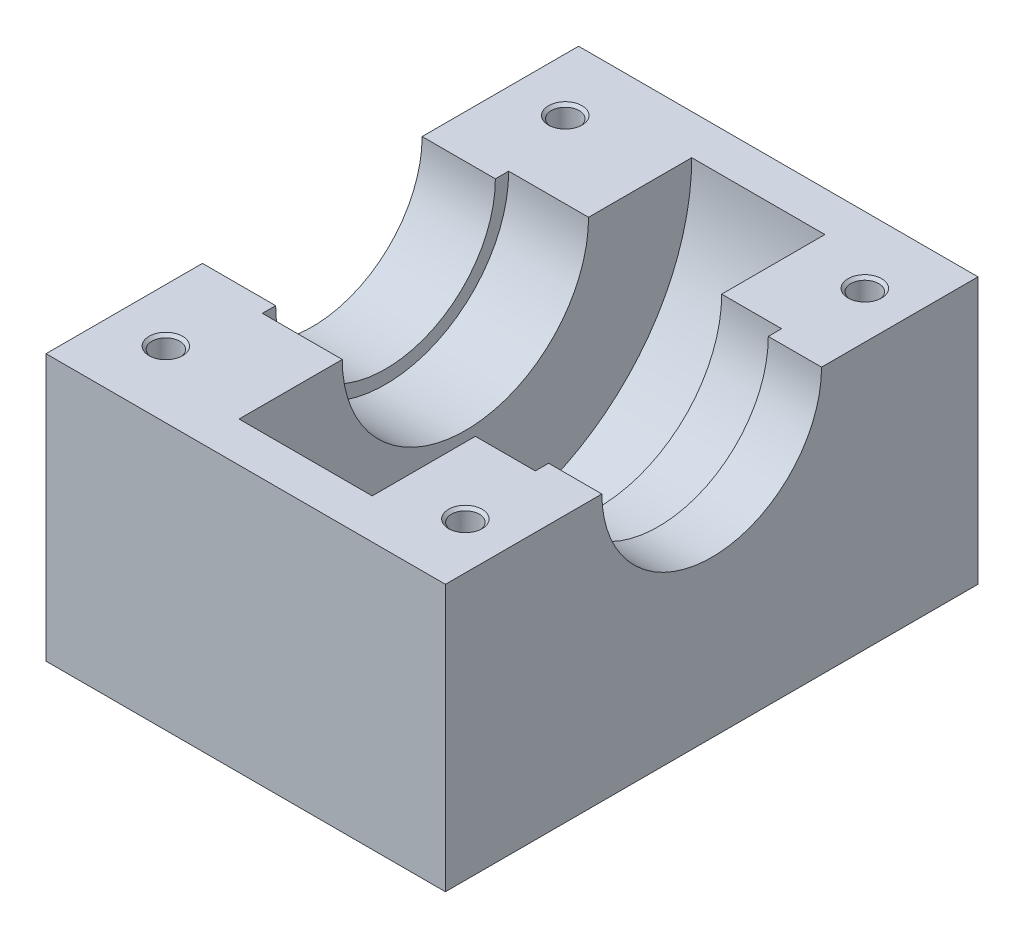
ISO-10303-21;
HEADER;
FILE_DESCRIPTION(('STEP AP214'),'2;1');
FILE_NAME('part.step','',(''),(''),'','','');
FILE_SCHEMA(('AUTOMOTIVE_DESIGN { 1 0 10303 214 1 1 1 1 }'));
ENDSEC;
DATA;
#1=APPLICATION_CONTEXT('core data for automotive mechanical design processes');
#2=APPLICATION_PROTOCOL_DEFINITION('international standard','automotive_design',2000,#1);
#3=PRODUCT_CONTEXT('',#1,'mechanical');
#4=PRODUCT('Part','Part','',(#3));
#5=PRODUCT_RELATED_PRODUCT_CATEGORY('part','',(#4));
#6=PRODUCT_DEFINITION_FORMATION('','',#4);
#7=PRODUCT_DEFINITION_CONTEXT('part definition',#1,'design');
#8=PRODUCT_DEFINITION('design','',#6,#7);
#9=PRODUCT_DEFINITION_SHAPE('','',#8);
#10=(LENGTH_UNIT() NAMED_UNIT(*) SI_UNIT(.MILLI.,.METRE.));
#11=(NAMED_UNIT(*) PLANE_ANGLE_UNIT() SI_UNIT($,.RADIAN.));
#12=(NAMED_UNIT(*) SI_UNIT($,.STERADIAN.) SOLID_ANGLE_UNIT());
#13=UNCERTAINTY_MEASURE_WITH_UNIT(LENGTH_MEASURE(1.E-05),#10,'distance_accuracy_value','');
#14=(GEOMETRIC_REPRESENTATION_CONTEXT(3) GLOBAL_UNCERTAINTY_ASSIGNED_CONTEXT((#13)) GLOBAL_UNIT_ASSIGNED_CONTEXT((#10,
#11,#12)) REPRESENTATION_CONTEXT('',''));
#15=CARTESIAN_POINT('',(0.,0.,0.));
#16=DIRECTION('',(0.,0.,1.));
#17=DIRECTION('',(1.,0.,0.));
#18=AXIS2_PLACEMENT_3D('',#15,#16,#17);
#19=CARTESIAN_POINT('',(0.,40.,0.));
#20=DIRECTION('',(0.,-1.,0.));
#21=DIRECTION('',(0.,0.,-1.));
#22=AXIS2_PLACEMENT_3D('',#19,#20,#21);
#23=PLANE('',#22);
#24=CARTESIAN_POINT('',(-22.,40.,-30.));
#25=DIRECTION('',(0.,1.,0.));
#26=DIRECTION('',(0.,0.,1.));
#27=AXIS2_PLACEMENT_3D('',#24,#25,#26);
#28=CIRCLE('',#27,2.525);
#29=CARTESIAN_POINT('',(-22.,40.,-27.475));
#30=VERTEX_POINT('',#29);
#31=EDGE_CURVE('E179',#30,#30,#28,.T.);
#32=ORIENTED_EDGE('',*,*,#31,.F.);
#33=EDGE_LOOP('',(#32));
#34=FACE_BOUND('',#33,.T.);
#35=CARTESIAN_POINT('',(23.,40.,-30.));
#36=DIRECTION('',(0.,1.,0.));
#37=DIRECTION('',(0.,0.,1.));
#38=AXIS2_PLACEMENT_3D('',#35,#36,#37);
#39=CIRCLE('',#38,2.525);
#40=CARTESIAN_POINT('',(23.,40.,-27.475));
#41=VERTEX_POINT('',#40);
#42=EDGE_CURVE('E170',#41,#41,#39,.T.);
#43=ORIENTED_EDGE('',*,*,#42,.F.);
#44=EDGE_LOOP('',(#43));
#45=FACE_BOUND('',#44,.T.);
#46=DIRECTION('',(-1.,0.,0.));
#47=VECTOR('',#46,1.);
#48=CARTESIAN_POINT('',(89.0263112349929,40.,-34.));
#49=LINE('',#48,#47);
#50=CARTESIAN_POINT('',(13.,40.,-34.));
#51=VERTEX_POINT('',#50);
#52=CARTESIAN_POINT('',(-7.,40.,-34.));
#53=VERTEX_POINT('',#52);
#54=EDGE_CURVE('E229',#51,#53,#49,.T.);
#55=ORIENTED_EDGE('',*,*,#54,.F.);
#56=DIRECTION('',(0.,0.,-1.));
#57=VECTOR('',#56,1.);
#58=CARTESIAN_POINT('',(13.,40.,0.));
#59=LINE('',#58,#57);
#60=CARTESIAN_POINT('',(13.,40.,-18.5));
#61=VERTEX_POINT('',#60);
#62=EDGE_CURVE('E226',#61,#51,#59,.T.);
#63=ORIENTED_EDGE('',*,*,#62,.F.);
#64=DIRECTION('',(1.,0.,0.));
#65=VECTOR('',#64,1.);
#66=CARTESIAN_POINT('',(13.,40.,-18.5));
#67=LINE('',#66,#65);
#68=CARTESIAN_POINT('',(22.,40.,-18.5));
#69=VERTEX_POINT('',#68);
#70=EDGE_CURVE('E281',#61,#69,#67,.T.);
#71=ORIENTED_EDGE('',*,*,#70,.T.);
#72=DIRECTION('',(0.,0.,1.));
#73=VECTOR('',#72,1.);
#74=CARTESIAN_POINT('',(22.,40.,-16.5));
#75=LINE('',#74,#73);
#76=CARTESIAN_POINT('',(22.,40.,-16.5));
#77=VERTEX_POINT('',#76);
#78=EDGE_CURVE('E270',#69,#77,#75,.T.);
#79=ORIENTED_EDGE('',*,*,#78,.T.);
#80=DIRECTION('',(1.,0.,0.));
#81=VECTOR('',#80,1.);
#82=CARTESIAN_POINT('',(-30.001,40.,-16.5));
#83=LINE('',#82,#81);
#84=CARTESIAN_POINT('',(30.,40.,-16.5));
#85=VERTEX_POINT('',#84);
#86=EDGE_CURVE('E294',#77,#85,#83,.T.);
#87=ORIENTED_EDGE('',*,*,#86,.T.);
#88=DIRECTION('',(0.,0.,-1.));
#89=VECTOR('',#88,1.);
#90=CARTESIAN_POINT('',(30.,40.,40.));
#91=LINE('',#90,#89);
#92=CARTESIAN_POINT('',(30.,40.,-40.));
#93=VERTEX_POINT('',#92);
#94=EDGE_CURVE('E310',#85,#93,#91,.T.);
#95=ORIENTED_EDGE('',*,*,#94,.T.);
#96=DIRECTION('',(-1.,0.,0.));
#97=VECTOR('',#96,1.);
#98=CARTESIAN_POINT('',(-30.,40.,-40.));
#99=LINE('',#98,#97);
#100=CARTESIAN_POINT('',(-30.,40.,-40.));
#101=VERTEX_POINT('',#100);
#102=EDGE_CURVE('E309',#93,#101,#99,.T.);
#103=ORIENTED_EDGE('',*,*,#102,.T.);
#104=DIRECTION('',(0.,0.,1.));
#105=VECTOR('',#104,1.);
#106=CARTESIAN_POINT('',(-30.,40.,40.));
#107=LINE('',#106,#105);
#108=CARTESIAN_POINT('',(-30.,40.,-16.5));
#109=VERTEX_POINT('',#108);
#110=EDGE_CURVE('E314',#101,#109,#107,.T.);
#111=ORIENTED_EDGE('',*,*,#110,.T.);
#112=CARTESIAN_POINT('',(-19.,40.,-16.5));
#113=VERTEX_POINT('',#112);
#114=EDGE_CURVE('E301',#109,#113,#83,.T.);
#115=ORIENTED_EDGE('',*,*,#114,.T.);
#116=DIRECTION('',(0.,0.,-1.));
#117=VECTOR('',#116,1.);
#118=CARTESIAN_POINT('',(-19.,40.,-18.5));
#119=LINE('',#118,#117);
#120=CARTESIAN_POINT('',(-19.,40.,-18.5));
#121=VERTEX_POINT('',#120);
#122=EDGE_CURVE('E61',#113,#121,#119,.T.);
#123=ORIENTED_EDGE('',*,*,#122,.T.);
#124=DIRECTION('',(-1.,0.,0.));
#125=VECTOR('',#124,1.);
#126=CARTESIAN_POINT('',(-7.,40.,-18.5));
#127=LINE('',#126,#125);
#128=CARTESIAN_POINT('',(-7.,40.,-18.5));
#129=VERTEX_POINT('',#128);
#130=EDGE_CURVE('E247',#129,#121,#127,.T.);
#131=ORIENTED_EDGE('',*,*,#130,.F.);
#132=DIRECTION('',(0.,0.,-1.));
#133=VECTOR('',#132,1.);
#134=CARTESIAN_POINT('',(-7.,40.,0.));
#135=LINE('',#134,#133);
#136=EDGE_CURVE('E214',#129,#53,#135,.T.);
#137=ORIENTED_EDGE('',*,*,#136,.T.);
#138=EDGE_LOOP('',(#55,#63,#71,#79,#87,#95,#103,#111,#115,#123,#131,#137));
#139=FACE_BOUND('',#138,.T.);
#140=ADVANCED_FACE('F45',(#34,#45,#139),#23,.F.);
#141=CARTESIAN_POINT('',(-22.,40.,30.));
#142=DIRECTION('',(0.,1.,0.));
#143=DIRECTION('',(0.,0.,1.));
#144=AXIS2_PLACEMENT_3D('',#141,#142,#143);
#145=CIRCLE('',#144,2.525);
#146=CARTESIAN_POINT('',(-22.,40.,32.525));
#147=VERTEX_POINT('',#146);
#148=EDGE_CURVE('E190',#147,#147,#145,.T.);
#149=ORIENTED_EDGE('',*,*,#148,.F.);
#150=EDGE_LOOP('',(#149));
#151=FACE_BOUND('',#150,.T.);
#152=CARTESIAN_POINT('',(23.,40.,30.));
#153=DIRECTION('',(0.,1.,0.));
#154=DIRECTION('',(0.,0.,1.));
#155=AXIS2_PLACEMENT_3D('',#152,#153,#154);
#156=CIRCLE('',#155,2.525);
#157=CARTESIAN_POINT('',(23.,40.,32.525));
#158=VERTEX_POINT('',#157);
#159=EDGE_CURVE('E202',#158,#158,#156,.T.);
#160=ORIENTED_EDGE('',*,*,#159,.F.);
#161=EDGE_LOOP('',(#160));
#162=FACE_BOUND('',#161,.T.);
#163=DIRECTION('',(1.,0.,0.));
#164=VECTOR('',#163,1.);
#165=CARTESIAN_POINT('',(13.,40.,18.5));
#166=LINE('',#165,#164);
#167=CARTESIAN_POINT('',(13.,40.,18.5));
#168=VERTEX_POINT('',#167);
#169=CARTESIAN_POINT('',(22.,40.,18.5));
#170=VERTEX_POINT('',#169);
#171=EDGE_CURVE('E269',#168,#170,#166,.T.);
#172=ORIENTED_EDGE('',*,*,#171,.F.);
#173=DIRECTION('',(0.,0.,-1.));
#174=VECTOR('',#173,1.);
#175=CARTESIAN_POINT('',(13.,40.,0.));
#176=LINE('',#175,#174);
#177=CARTESIAN_POINT('',(13.,40.,34.));
#178=VERTEX_POINT('',#177);
#179=EDGE_CURVE('E230',#178,#168,#176,.T.);
#180=ORIENTED_EDGE('',*,*,#179,.F.);
#181=DIRECTION('',(-1.,0.,0.));
#182=VECTOR('',#181,1.);
#183=CARTESIAN_POINT('',(89.0263112349929,40.,34.));
#184=LINE('',#183,#182);
#185=CARTESIAN_POINT('',(-7.,40.,34.));
#186=VERTEX_POINT('',#185);
#187=EDGE_CURVE('E234',#178,#186,#184,.T.);
#188=ORIENTED_EDGE('',*,*,#187,.T.);
#189=DIRECTION('',(0.,0.,-1.));
#190=VECTOR('',#189,1.);
#191=CARTESIAN_POINT('',(-7.,40.,0.));
#192=LINE('',#191,#190);
#193=CARTESIAN_POINT('',(-7.,40.,18.5));
#194=VERTEX_POINT('',#193);
#195=EDGE_CURVE('E222',#186,#194,#192,.T.);
#196=ORIENTED_EDGE('',*,*,#195,.T.);
#197=DIRECTION('',(-1.,0.,0.));
#198=VECTOR('',#197,1.);
#199=CARTESIAN_POINT('',(-7.,40.,18.5));
#200=LINE('',#199,#198);
#201=CARTESIAN_POINT('',(-19.,40.,18.5));
#202=VERTEX_POINT('',#201);
#203=EDGE_CURVE('E259',#194,#202,#200,.T.);
#204=ORIENTED_EDGE('',*,*,#203,.T.);
#205=DIRECTION('',(0.,0.,-1.));
#206=VECTOR('',#205,1.);
#207=CARTESIAN_POINT('',(-19.,40.,16.5));
#208=LINE('',#207,#206);
#209=CARTESIAN_POINT('',(-19.,40.,16.5));
#210=VERTEX_POINT('',#209);
#211=EDGE_CURVE('E248',#202,#210,#208,.T.);
#212=ORIENTED_EDGE('',*,*,#211,.T.);
#213=DIRECTION('',(1.,0.,0.));
#214=VECTOR('',#213,1.);
#215=CARTESIAN_POINT('',(-30.001,40.,16.5));
#216=LINE('',#215,#214);
#217=CARTESIAN_POINT('',(-30.,40.,16.5));
#218=VERTEX_POINT('',#217);
#219=EDGE_CURVE('E295',#218,#210,#216,.T.);
#220=ORIENTED_EDGE('',*,*,#219,.F.);
#221=CARTESIAN_POINT('',(-30.,40.,40.));
#222=VERTEX_POINT('',#221);
#223=EDGE_CURVE('E313',#218,#222,#107,.T.);
#224=ORIENTED_EDGE('',*,*,#223,.T.);
#225=DIRECTION('',(1.,0.,0.));
#226=VECTOR('',#225,1.);
#227=CARTESIAN_POINT('',(-30.,40.,40.));
#228=LINE('',#227,#226);
#229=CARTESIAN_POINT('',(30.,40.,40.));
#230=VERTEX_POINT('',#229);
#231=EDGE_CURVE('E318',#222,#230,#228,.T.);
#232=ORIENTED_EDGE('',*,*,#231,.T.);
#233=CARTESIAN_POINT('',(30.,40.,16.5));
#234=VERTEX_POINT('',#233);
#235=EDGE_CURVE('E305',#230,#234,#91,.T.);
#236=ORIENTED_EDGE('',*,*,#235,.T.);
#237=CARTESIAN_POINT('',(22.,40.,16.5));
#238=VERTEX_POINT('',#237);
#239=EDGE_CURVE('E300',#238,#234,#216,.T.);
#240=ORIENTED_EDGE('',*,*,#239,.F.);
#241=DIRECTION('',(0.,0.,1.));
#242=VECTOR('',#241,1.);
#243=CARTESIAN_POINT('',(22.,40.,18.5));
#244=LINE('',#243,#242);
#245=EDGE_CURVE('E69',#238,#170,#244,.T.);
#246=ORIENTED_EDGE('',*,*,#245,.T.);
#247=EDGE_LOOP('',(#172,#180,#188,#196,#204,#212,#220,#224,#232,#236,#240,#246));
#248=FACE_BOUND('',#247,.T.);
#249=ADVANCED_FACE('F368',(#151,#162,#248),#23,.F.);
#250=CARTESIAN_POINT('',(-30.001,40.,0.));
#251=DIRECTION('',(1.,0.,0.));
#252=DIRECTION('',(0.,0.,-1.));
#253=AXIS2_PLACEMENT_3D('',#250,#251,#252);
#254=CYLINDRICAL_SURFACE('',#253,16.5);
#255=ORIENTED_EDGE('',*,*,#219,.T.);
#256=CARTESIAN_POINT('',(-19.,40.,0.));
#257=DIRECTION('',(1.,0.,0.));
#258=DIRECTION('',(0.,0.,1.));
#259=AXIS2_PLACEMENT_3D('',#256,#257,#258);
#260=CIRCLE('',#259,16.5);
#261=EDGE_CURVE('E233',#210,#113,#260,.T.);
#262=ORIENTED_EDGE('',*,*,#261,.T.);
#263=ORIENTED_EDGE('',*,*,#114,.F.);
#264=CARTESIAN_POINT('',(-30.,40.,0.));
#265=DIRECTION('',(1.,0.,0.));
#266=DIRECTION('',(0.,0.,-1.));
#267=AXIS2_PLACEMENT_3D('',#264,#265,#266);
#268=CIRCLE('',#267,16.5);
#269=EDGE_CURVE('E285',#109,#218,#268,.F.);
#270=ORIENTED_EDGE('',*,*,#269,.T.);
#271=EDGE_LOOP('',(#255,#262,#263,#270));
#272=FACE_BOUND('',#271,.T.);
#273=ADVANCED_FACE('F383',(#272),#254,.F.);
#274=CARTESIAN_POINT('',(30.,40.,40.));
#275=DIRECTION('',(-1.,0.,0.));
#276=DIRECTION('',(0.,0.,1.));
#277=AXIS2_PLACEMENT_3D('',#274,#275,#276);
#278=PLANE('',#277);
#279=ORIENTED_EDGE('',*,*,#94,.F.);
#280=CARTESIAN_POINT('',(30.,40.,0.));
#281=DIRECTION('',(1.,0.,0.));
#282=DIRECTION('',(0.,0.,-1.));
#283=AXIS2_PLACEMENT_3D('',#280,#281,#282);
#284=CIRCLE('',#283,16.5);
#285=EDGE_CURVE('E290',#234,#85,#284,.T.);
#286=ORIENTED_EDGE('',*,*,#285,.F.);
#287=ORIENTED_EDGE('',*,*,#235,.F.);
#288=DIRECTION('',(0.,-1.,0.));
#289=VECTOR('',#288,1.);
#290=CARTESIAN_POINT('',(30.,40.,40.));
#291=LINE('',#290,#289);
#292=CARTESIAN_POINT('',(30.,0.,40.));
#293=VERTEX_POINT('',#292);
#294=EDGE_CURVE('E321',#230,#293,#291,.T.);
#295=ORIENTED_EDGE('',*,*,#294,.T.);
#296=DIRECTION('',(0.,0.,-1.));
#297=VECTOR('',#296,1.);
#298=CARTESIAN_POINT('',(30.,0.,40.));
#299=LINE('',#298,#297);
#300=CARTESIAN_POINT('',(30.,0.,-40.));
#301=VERTEX_POINT('',#300);
#302=EDGE_CURVE('E299',#293,#301,#299,.T.);
#303=ORIENTED_EDGE('',*,*,#302,.T.);
#304=DIRECTION('',(0.,-1.,0.));
#305=VECTOR('',#304,1.);
#306=CARTESIAN_POINT('',(30.,40.,-40.));
#307=LINE('',#306,#305);
#308=EDGE_CURVE('E11',#93,#301,#307,.T.);
#309=ORIENTED_EDGE('',*,*,#308,.F.);
#310=EDGE_LOOP('',(#279,#286,#287,#295,#303,#309));
#311=FACE_BOUND('',#310,.T.);
#312=ADVANCED_FACE('F47',(#311),#278,.F.);
#313=CARTESIAN_POINT('',(-30.,40.,-40.));
#314=DIRECTION('',(0.,0.,1.));
#315=DIRECTION('',(1.,0.,0.));
#316=AXIS2_PLACEMENT_3D('',#313,#314,#315);
#317=PLANE('',#316);
#318=DIRECTION('',(-1.,0.,0.));
#319=VECTOR('',#318,1.);
#320=CARTESIAN_POINT('',(-30.,0.,-40.));
#321=LINE('',#320,#319);
#322=CARTESIAN_POINT('',(-30.,0.,-40.));
#323=VERTEX_POINT('',#322);
#324=EDGE_CURVE('E325',#301,#323,#321,.T.);
#325=ORIENTED_EDGE('',*,*,#324,.T.);
#326=DIRECTION('',(0.,-1.,0.));
#327=VECTOR('',#326,1.);
#328=CARTESIAN_POINT('',(-30.,40.,-40.));
#329=LINE('',#328,#327);
#330=EDGE_CURVE('E54',#101,#323,#329,.T.);
#331=ORIENTED_EDGE('',*,*,#330,.F.);
#332=ORIENTED_EDGE('',*,*,#102,.F.);
#333=ORIENTED_EDGE('',*,*,#308,.T.);
#334=EDGE_LOOP('',(#325,#331,#332,#333));
#335=FACE_BOUND('',#334,.T.);
#336=ADVANCED_FACE('F380',(#335),#317,.F.);
#337=CARTESIAN_POINT('',(-30.,40.,40.));
#338=DIRECTION('',(1.,0.,0.));
#339=DIRECTION('',(0.,0.,-1.));
#340=AXIS2_PLACEMENT_3D('',#337,#338,#339);
#341=PLANE('',#340);
#342=ORIENTED_EDGE('',*,*,#223,.F.);
#343=ORIENTED_EDGE('',*,*,#269,.F.);
#344=ORIENTED_EDGE('',*,*,#110,.F.);
#345=ORIENTED_EDGE('',*,*,#330,.T.);
#346=DIRECTION('',(0.,0.,1.));
#347=VECTOR('',#346,1.);
#348=CARTESIAN_POINT('',(-30.,0.,40.));
#349=LINE('',#348,#347);
#350=CARTESIAN_POINT('',(-30.,0.,40.));
#351=VERTEX_POINT('',#350);
#352=EDGE_CURVE('E328',#323,#351,#349,.T.);
#353=ORIENTED_EDGE('',*,*,#352,.T.);
#354=DIRECTION('',(0.,-1.,0.));
#355=VECTOR('',#354,1.);
#356=CARTESIAN_POINT('',(-30.,40.,40.));
#357=LINE('',#356,#355);
#358=EDGE_CURVE('E337',#222,#351,#357,.T.);
#359=ORIENTED_EDGE('',*,*,#358,.F.);
#360=EDGE_LOOP('',(#342,#343,#344,#345,#353,#359));
#361=FACE_BOUND('',#360,.T.);
#362=ADVANCED_FACE('F347',(#361),#341,.F.);
#363=CARTESIAN_POINT('',(-30.,40.,40.));
#364=DIRECTION('',(0.,0.,-1.));
#365=DIRECTION('',(-1.,0.,0.));
#366=AXIS2_PLACEMENT_3D('',#363,#364,#365);
#367=PLANE('',#366);
#368=DIRECTION('',(1.,0.,0.));
#369=VECTOR('',#368,1.);
#370=CARTESIAN_POINT('',(-30.,0.,40.));
#371=LINE('',#370,#369);
#372=EDGE_CURVE('E331',#351,#293,#371,.T.);
#373=ORIENTED_EDGE('',*,*,#372,.T.);
#374=ORIENTED_EDGE('',*,*,#294,.F.);
#375=ORIENTED_EDGE('',*,*,#231,.F.);
#376=ORIENTED_EDGE('',*,*,#358,.T.);
#377=EDGE_LOOP('',(#373,#374,#375,#376));
#378=FACE_BOUND('',#377,.T.);
#379=ADVANCED_FACE('F358',(#378),#367,.F.);
#380=CARTESIAN_POINT('',(0.,0.,0.));
#381=DIRECTION('',(0.,-1.,0.));
#382=DIRECTION('',(0.,0.,-1.));
#383=AXIS2_PLACEMENT_3D('',#380,#381,#382);
#384=PLANE('',#383);
#385=ORIENTED_EDGE('',*,*,#302,.F.);
#386=ORIENTED_EDGE('',*,*,#372,.F.);
#387=ORIENTED_EDGE('',*,*,#352,.F.);
#388=ORIENTED_EDGE('',*,*,#324,.F.);
#389=EDGE_LOOP('',(#385,#386,#387,#388));
#390=FACE_BOUND('',#389,.T.);
#391=ADVANCED_FACE('F355',(#390),#384,.T.);
#392=ORIENTED_EDGE('',*,*,#86,.F.);
#393=CARTESIAN_POINT('',(22.,40.,0.));
#394=DIRECTION('',(-1.,0.,0.));
#395=DIRECTION('',(0.,0.,-1.));
#396=AXIS2_PLACEMENT_3D('',#393,#394,#395);
#397=CIRCLE('',#396,16.5);
#398=EDGE_CURVE('E263',#77,#238,#397,.T.);
#399=ORIENTED_EDGE('',*,*,#398,.T.);
#400=ORIENTED_EDGE('',*,*,#239,.T.);
#401=ORIENTED_EDGE('',*,*,#285,.T.);
#402=EDGE_LOOP('',(#392,#399,#400,#401));
#403=FACE_BOUND('',#402,.T.);
#404=ADVANCED_FACE('F379',(#403),#254,.F.);
#405=CARTESIAN_POINT('',(13.,40.,0.));
#406=DIRECTION('',(1.,0.,0.));
#407=DIRECTION('',(0.,0.,-1.));
#408=AXIS2_PLACEMENT_3D('',#405,#406,#407);
#409=CYLINDRICAL_SURFACE('',#408,18.5);
#410=CARTESIAN_POINT('',(22.,40.,0.));
#411=DIRECTION('',(1.,0.,0.));
#412=DIRECTION('',(0.,0.,-1.));
#413=AXIS2_PLACEMENT_3D('',#410,#411,#412);
#414=CIRCLE('',#413,18.5);
#415=EDGE_CURVE('E275',#170,#69,#414,.T.);
#416=ORIENTED_EDGE('',*,*,#415,.T.);
#417=ORIENTED_EDGE('',*,*,#70,.F.);
#418=CARTESIAN_POINT('',(13.,40.,0.));
#419=DIRECTION('',(1.,0.,0.));
#420=DIRECTION('',(0.,0.,-1.));
#421=AXIS2_PLACEMENT_3D('',#418,#419,#420);
#422=CIRCLE('',#421,18.5);
#423=EDGE_CURVE('E266',#168,#61,#422,.T.);
#424=ORIENTED_EDGE('',*,*,#423,.F.);
#425=ORIENTED_EDGE('',*,*,#171,.T.);
#426=EDGE_LOOP('',(#416,#417,#424,#425));
#427=FACE_BOUND('',#426,.T.);
#428=ADVANCED_FACE('F403',(#427),#409,.F.);
#429=CARTESIAN_POINT('',(22.,40.,0.));
#430=DIRECTION('',(1.,0.,0.));
#431=DIRECTION('',(0.,0.,-1.));
#432=AXIS2_PLACEMENT_3D('',#429,#430,#431);
#433=PLANE('',#432);
#434=ORIENTED_EDGE('',*,*,#398,.F.);
#435=ORIENTED_EDGE('',*,*,#78,.F.);
#436=ORIENTED_EDGE('',*,*,#415,.F.);
#437=ORIENTED_EDGE('',*,*,#245,.F.);
#438=EDGE_LOOP('',(#434,#435,#436,#437));
#439=FACE_BOUND('',#438,.T.);
#440=ADVANCED_FACE('F404',(#439),#433,.F.);
#441=CARTESIAN_POINT('',(-7.,40.,0.));
#442=DIRECTION('',(-1.,0.,0.));
#443=DIRECTION('',(0.,0.,1.));
#444=AXIS2_PLACEMENT_3D('',#441,#442,#443);
#445=CYLINDRICAL_SURFACE('',#444,18.5);
#446=CARTESIAN_POINT('',(-19.,40.,0.));
#447=DIRECTION('',(-1.,0.,0.));
#448=DIRECTION('',(0.,0.,1.));
#449=AXIS2_PLACEMENT_3D('',#446,#447,#448);
#450=CIRCLE('',#449,18.5);
#451=EDGE_CURVE('E253',#121,#202,#450,.T.);
#452=ORIENTED_EDGE('',*,*,#451,.T.);
#453=ORIENTED_EDGE('',*,*,#203,.F.);
#454=CARTESIAN_POINT('',(-7.,40.,0.));
#455=DIRECTION('',(-1.,0.,0.));
#456=DIRECTION('',(0.,0.,1.));
#457=AXIS2_PLACEMENT_3D('',#454,#455,#456);
#458=CIRCLE('',#457,18.5);
#459=EDGE_CURVE('E244',#129,#194,#458,.T.);
#460=ORIENTED_EDGE('',*,*,#459,.F.);
#461=ORIENTED_EDGE('',*,*,#130,.T.);
#462=EDGE_LOOP('',(#452,#453,#460,#461));
#463=FACE_BOUND('',#462,.T.);
#464=ADVANCED_FACE('F389',(#463),#445,.F.);
#465=CARTESIAN_POINT('',(-19.,40.,0.));
#466=DIRECTION('',(-1.,0.,0.));
#467=DIRECTION('',(0.,0.,1.));
#468=AXIS2_PLACEMENT_3D('',#465,#466,#467);
#469=PLANE('',#468);
#470=ORIENTED_EDGE('',*,*,#261,.F.);
#471=ORIENTED_EDGE('',*,*,#211,.F.);
#472=ORIENTED_EDGE('',*,*,#451,.F.);
#473=ORIENTED_EDGE('',*,*,#122,.F.);
#474=EDGE_LOOP('',(#470,#471,#472,#473));
#475=FACE_BOUND('',#474,.T.);
#476=ADVANCED_FACE('F385',(#475),#469,.F.);
#477=CARTESIAN_POINT('',(13.,40.,0.));
#478=DIRECTION('',(1.,0.,0.));
#479=DIRECTION('',(0.,0.,-1.));
#480=AXIS2_PLACEMENT_3D('',#477,#478,#479);
#481=PLANE('',#480);
#482=ORIENTED_EDGE('',*,*,#62,.T.);
#483=CARTESIAN_POINT('',(13.,40.,0.));
#484=DIRECTION('',(1.,0.,0.));
#485=DIRECTION('',(0.,0.,-1.));
#486=AXIS2_PLACEMENT_3D('',#483,#484,#485);
#487=CIRCLE('',#486,34.);
#488=EDGE_CURVE('E235',#51,#178,#487,.F.);
#489=ORIENTED_EDGE('',*,*,#488,.T.);
#490=ORIENTED_EDGE('',*,*,#179,.T.);
#491=ORIENTED_EDGE('',*,*,#423,.T.);
#492=EDGE_LOOP('',(#482,#489,#490,#491));
#493=FACE_BOUND('',#492,.T.);
#494=ADVANCED_FACE('F400',(#493),#481,.F.);
#495=CARTESIAN_POINT('',(-7.,40.,0.));
#496=DIRECTION('',(-1.,0.,0.));
#497=DIRECTION('',(0.,0.,1.));
#498=AXIS2_PLACEMENT_3D('',#495,#496,#497);
#499=PLANE('',#498);
#500=ORIENTED_EDGE('',*,*,#195,.F.);
#501=CARTESIAN_POINT('',(-7.,40.,0.));
#502=DIRECTION('',(-1.,0.,0.));
#503=DIRECTION('',(0.,0.,1.));
#504=AXIS2_PLACEMENT_3D('',#501,#502,#503);
#505=CIRCLE('',#504,34.);
#506=EDGE_CURVE('E218',#53,#186,#505,.T.);
#507=ORIENTED_EDGE('',*,*,#506,.F.);
#508=ORIENTED_EDGE('',*,*,#136,.F.);
#509=ORIENTED_EDGE('',*,*,#459,.T.);
#510=EDGE_LOOP('',(#500,#507,#508,#509));
#511=FACE_BOUND('',#510,.T.);
#512=ADVANCED_FACE('F393',(#511),#499,.F.);
#513=CARTESIAN_POINT('',(89.0263112349929,40.,0.));
#514=DIRECTION('',(-1.,0.,0.));
#515=DIRECTION('',(0.,0.,1.));
#516=AXIS2_PLACEMENT_3D('',#513,#514,#515);
#517=CYLINDRICAL_SURFACE('',#516,34.);
#518=ORIENTED_EDGE('',*,*,#54,.T.);
#519=ORIENTED_EDGE('',*,*,#506,.T.);
#520=ORIENTED_EDGE('',*,*,#187,.F.);
#521=ORIENTED_EDGE('',*,*,#488,.F.);
#522=EDGE_LOOP('',(#518,#519,#520,#521));
#523=FACE_BOUND('',#522,.T.);
#524=ADVANCED_FACE('F395',(#523),#517,.F.);
#525=CARTESIAN_POINT('',(23.,27.2618072999579,30.));
#526=DIRECTION('',(0.,1.,0.));
#527=DIRECTION('',(0.,0.,1.));
#528=AXIS2_PLACEMENT_3D('',#525,#526,#527);
#529=CONICAL_SURFACE('',#528,2.1,1.02974425867665);
#530=CARTESIAN_POINT('',(23.,26.,30.));
#531=VERTEX_POINT('',#530);
#532=VERTEX_LOOP('',#531);
#533=FACE_BOUND('',#532,.T.);
#534=CARTESIAN_POINT('',(23.,27.2618072999579,30.));
#535=DIRECTION('',(0.,1.,0.));
#536=DIRECTION('',(0.,0.,1.));
#537=AXIS2_PLACEMENT_3D('',#534,#535,#536);
#538=CIRCLE('',#537,2.1);
#539=CARTESIAN_POINT('',(23.,27.2618072999579,32.1));
#540=VERTEX_POINT('',#539);
#541=EDGE_CURVE('E210',#540,#540,#538,.T.);
#542=ORIENTED_EDGE('',*,*,#541,.T.);
#543=EDGE_LOOP('',(#542));
#544=FACE_BOUND('',#543,.T.);
#545=ADVANCED_FACE('F485',(#533,#544),#529,.F.);
#546=CARTESIAN_POINT('',(23.,40.,30.));
#547=DIRECTION('',(0.,1.,0.));
#548=DIRECTION('',(0.,0.,1.));
#549=AXIS2_PLACEMENT_3D('',#546,#547,#548);
#550=CYLINDRICAL_SURFACE('',#549,2.1);
#551=ORIENTED_EDGE('',*,*,#541,.F.);
#552=EDGE_LOOP('',(#551));
#553=FACE_BOUND('',#552,.T.);
#554=CARTESIAN_POINT('',(23.,39.575,30.));
#555=DIRECTION('',(0.,1.,0.));
#556=DIRECTION('',(0.,0.,1.));
#557=AXIS2_PLACEMENT_3D('',#554,#555,#556);
#558=CIRCLE('',#557,2.1);
#559=CARTESIAN_POINT('',(23.,39.575,32.1));
#560=VERTEX_POINT('',#559);
#561=EDGE_CURVE('E206',#560,#560,#558,.T.);
#562=ORIENTED_EDGE('',*,*,#561,.T.);
#563=EDGE_LOOP('',(#562));
#564=FACE_BOUND('',#563,.T.);
#565=ADVANCED_FACE('F504',(#553,#564),#550,.F.);
#566=CARTESIAN_POINT('',(23.,40.,30.));
#567=DIRECTION('',(0.,1.,0.));
#568=DIRECTION('',(0.,0.,1.));
#569=AXIS2_PLACEMENT_3D('',#566,#567,#568);
#570=CONICAL_SURFACE('',#569,2.525,0.785398163397448);
#571=ORIENTED_EDGE('',*,*,#561,.F.);
#572=EDGE_LOOP('',(#571));
#573=FACE_BOUND('',#572,.T.);
#574=ORIENTED_EDGE('',*,*,#159,.T.);
#575=EDGE_LOOP('',(#574));
#576=FACE_BOUND('',#575,.T.);
#577=ADVANCED_FACE('F515',(#573,#576),#570,.F.);
#578=CARTESIAN_POINT('',(-22.,27.2618072999579,30.));
#579=DIRECTION('',(0.,1.,0.));
#580=DIRECTION('',(0.,0.,1.));
#581=AXIS2_PLACEMENT_3D('',#578,#579,#580);
#582=CONICAL_SURFACE('',#581,2.1,1.02974425867665);
#583=CARTESIAN_POINT('',(-22.,26.,30.));
#584=VERTEX_POINT('',#583);
#585=VERTEX_LOOP('',#584);
#586=FACE_BOUND('',#585,.T.);
#587=CARTESIAN_POINT('',(-22.,27.2618072999579,30.));
#588=DIRECTION('',(0.,1.,0.));
#589=DIRECTION('',(0.,0.,1.));
#590=AXIS2_PLACEMENT_3D('',#587,#588,#589);
#591=CIRCLE('',#590,2.1);
#592=CARTESIAN_POINT('',(-22.,27.2618072999579,32.1));
#593=VERTEX_POINT('',#592);
#594=EDGE_CURVE('E198',#593,#593,#591,.T.);
#595=ORIENTED_EDGE('',*,*,#594,.T.);
#596=EDGE_LOOP('',(#595));
#597=FACE_BOUND('',#596,.T.);
#598=ADVANCED_FACE('F528',(#586,#597),#582,.F.);
#599=CARTESIAN_POINT('',(-22.,40.,30.));
#600=DIRECTION('',(0.,1.,0.));
#601=DIRECTION('',(0.,0.,1.));
#602=AXIS2_PLACEMENT_3D('',#599,#600,#601);
#603=CYLINDRICAL_SURFACE('',#602,2.1);
#604=ORIENTED_EDGE('',*,*,#594,.F.);
#605=EDGE_LOOP('',(#604));
#606=FACE_BOUND('',#605,.T.);
#607=CARTESIAN_POINT('',(-22.,39.575,30.));
#608=DIRECTION('',(0.,1.,0.));
#609=DIRECTION('',(0.,0.,1.));
#610=AXIS2_PLACEMENT_3D('',#607,#608,#609);
#611=CIRCLE('',#610,2.1);
#612=CARTESIAN_POINT('',(-22.,39.575,32.1));
#613=VERTEX_POINT('',#612);
#614=EDGE_CURVE('E194',#613,#613,#611,.T.);
#615=ORIENTED_EDGE('',*,*,#614,.T.);
#616=EDGE_LOOP('',(#615));
#617=FACE_BOUND('',#616,.T.);
#618=ADVANCED_FACE('F540',(#606,#617),#603,.F.);
#619=CARTESIAN_POINT('',(-22.,40.,30.));
#620=DIRECTION('',(0.,1.,0.));
#621=DIRECTION('',(0.,0.,1.));
#622=AXIS2_PLACEMENT_3D('',#619,#620,#621);
#623=CONICAL_SURFACE('',#622,2.525,0.785398163397448);
#624=ORIENTED_EDGE('',*,*,#614,.F.);
#625=EDGE_LOOP('',(#624));
#626=FACE_BOUND('',#625,.T.);
#627=ORIENTED_EDGE('',*,*,#148,.T.);
#628=EDGE_LOOP('',(#627));
#629=FACE_BOUND('',#628,.T.);
#630=ADVANCED_FACE('F550',(#626,#629),#623,.F.);
#631=CARTESIAN_POINT('',(23.,27.2618072999579,-30.));
#632=DIRECTION('',(0.,1.,0.));
#633=DIRECTION('',(0.,0.,1.));
#634=AXIS2_PLACEMENT_3D('',#631,#632,#633);
#635=CONICAL_SURFACE('',#634,2.1,1.02974425867665);
#636=CARTESIAN_POINT('',(23.,26.,-30.));
#637=VERTEX_POINT('',#636);
#638=VERTEX_LOOP('',#637);
#639=FACE_BOUND('',#638,.T.);
#640=CARTESIAN_POINT('',(23.,27.2618072999579,-30.));
#641=DIRECTION('',(0.,1.,0.));
#642=DIRECTION('',(0.,0.,1.));
#643=AXIS2_PLACEMENT_3D('',#640,#641,#642);
#644=CIRCLE('',#643,2.1);
#645=CARTESIAN_POINT('',(23.,27.2618072999579,-27.9));
#646=VERTEX_POINT('',#645);
#647=EDGE_CURVE('E186',#646,#646,#644,.T.);
#648=ORIENTED_EDGE('',*,*,#647,.T.);
#649=EDGE_LOOP('',(#648));
#650=FACE_BOUND('',#649,.T.);
#651=ADVANCED_FACE('F563',(#639,#650),#635,.F.);
#652=CARTESIAN_POINT('',(23.,40.,-30.));
#653=DIRECTION('',(0.,1.,0.));
#654=DIRECTION('',(0.,0.,1.));
#655=AXIS2_PLACEMENT_3D('',#652,#653,#654);
#656=CYLINDRICAL_SURFACE('',#655,2.1);
#657=ORIENTED_EDGE('',*,*,#647,.F.);
#658=EDGE_LOOP('',(#657));
#659=FACE_BOUND('',#658,.T.);
#660=CARTESIAN_POINT('',(23.,39.575,-30.));
#661=DIRECTION('',(0.,1.,0.));
#662=DIRECTION('',(0.,0.,1.));
#663=AXIS2_PLACEMENT_3D('',#660,#661,#662);
#664=CIRCLE('',#663,2.1);
#665=CARTESIAN_POINT('',(23.,39.575,-27.9));
#666=VERTEX_POINT('',#665);
#667=EDGE_CURVE('E176',#666,#666,#664,.T.);
#668=ORIENTED_EDGE('',*,*,#667,.T.);
#669=EDGE_LOOP('',(#668));
#670=FACE_BOUND('',#669,.T.);
#671=ADVANCED_FACE('F574',(#659,#670),#656,.F.);
#672=CARTESIAN_POINT('',(23.,40.,-30.));
#673=DIRECTION('',(0.,1.,0.));
#674=DIRECTION('',(0.,0.,1.));
#675=AXIS2_PLACEMENT_3D('',#672,#673,#674);
#676=CONICAL_SURFACE('',#675,2.525,0.785398163397448);
#677=ORIENTED_EDGE('',*,*,#667,.F.);
#678=EDGE_LOOP('',(#677));
#679=FACE_BOUND('',#678,.T.);
#680=ORIENTED_EDGE('',*,*,#42,.T.);
#681=EDGE_LOOP('',(#680));
#682=FACE_BOUND('',#681,.T.);
#683=ADVANCED_FACE('F163',(#679,#682),#676,.F.);
#684=CARTESIAN_POINT('',(-22.,27.2618072999579,-30.));
#685=DIRECTION('',(0.,1.,0.));
#686=DIRECTION('',(0.,0.,1.));
#687=AXIS2_PLACEMENT_3D('',#684,#685,#686);
#688=CONICAL_SURFACE('',#687,2.1,1.02974425867665);
#689=CARTESIAN_POINT('',(-22.,26.,-30.));
#690=VERTEX_POINT('',#689);
#691=VERTEX_LOOP('',#690);
#692=FACE_BOUND('',#691,.T.);
#693=CARTESIAN_POINT('',(-22.,27.2618072999579,-30.));
#694=DIRECTION('',(0.,1.,0.));
#695=DIRECTION('',(0.,0.,1.));
#696=AXIS2_PLACEMENT_3D('',#693,#694,#695);
#697=CIRCLE('',#696,2.1);
#698=CARTESIAN_POINT('',(-22.,27.2618072999579,-27.9));
#699=VERTEX_POINT('',#698);
#700=EDGE_CURVE('E167',#699,#699,#697,.T.);
#701=ORIENTED_EDGE('',*,*,#700,.T.);
#702=EDGE_LOOP('',(#701));
#703=FACE_BOUND('',#702,.T.);
#704=ADVANCED_FACE('F159',(#692,#703),#688,.F.);
#705=CARTESIAN_POINT('',(-22.,40.,-30.));
#706=DIRECTION('',(0.,1.,0.));
#707=DIRECTION('',(0.,0.,1.));
#708=AXIS2_PLACEMENT_3D('',#705,#706,#707);
#709=CYLINDRICAL_SURFACE('',#708,2.1);
#710=ORIENTED_EDGE('',*,*,#700,.F.);
#711=EDGE_LOOP('',(#710));
#712=FACE_BOUND('',#711,.T.);
#713=CARTESIAN_POINT('',(-22.,39.575,-30.));
#714=DIRECTION('',(0.,1.,0.));
#715=DIRECTION('',(0.,0.,1.));
#716=AXIS2_PLACEMENT_3D('',#713,#714,#715);
#717=CIRCLE('',#716,2.1);
#718=CARTESIAN_POINT('',(-22.,39.575,-27.9));
#719=VERTEX_POINT('',#718);
#720=EDGE_CURVE('E171',#719,#719,#717,.T.);
#721=ORIENTED_EDGE('',*,*,#720,.T.);
#722=EDGE_LOOP('',(#721));
#723=FACE_BOUND('',#722,.T.);
#724=ADVANCED_FACE('F162',(#712,#723),#709,.F.);
#725=CARTESIAN_POINT('',(-22.,40.,-30.));
#726=DIRECTION('',(0.,1.,0.));
#727=DIRECTION('',(0.,0.,1.));
#728=AXIS2_PLACEMENT_3D('',#725,#726,#727);
#729=CONICAL_SURFACE('',#728,2.525,0.785398163397448);
#730=ORIENTED_EDGE('',*,*,#720,.F.);
#731=EDGE_LOOP('',(#730));
#732=FACE_BOUND('',#731,.T.);
#733=ORIENTED_EDGE('',*,*,#31,.T.);
#734=EDGE_LOOP('',(#733));
#735=FACE_BOUND('',#734,.T.);
#736=ADVANCED_FACE('F612',(#732,#735),#729,.F.);
#737=CLOSED_SHELL('',(#140,#249,#273,#312,#336,#362,#379,#391,#404,#428,#440,#464,#476,#494,
#512,#524,#545,#565,#577,#598,#618,#630,#651,#671,#683,#704,#724,#736));
#738=MANIFOLD_SOLID_BREP('B2',#737);
#739=ADVANCED_BREP_SHAPE_REPRESENTATION('',(#18,#738),#14);
#740=SHAPE_DEFINITION_REPRESENTATION(#9,#739);
ENDSEC;
END-ISO-10303-21;
